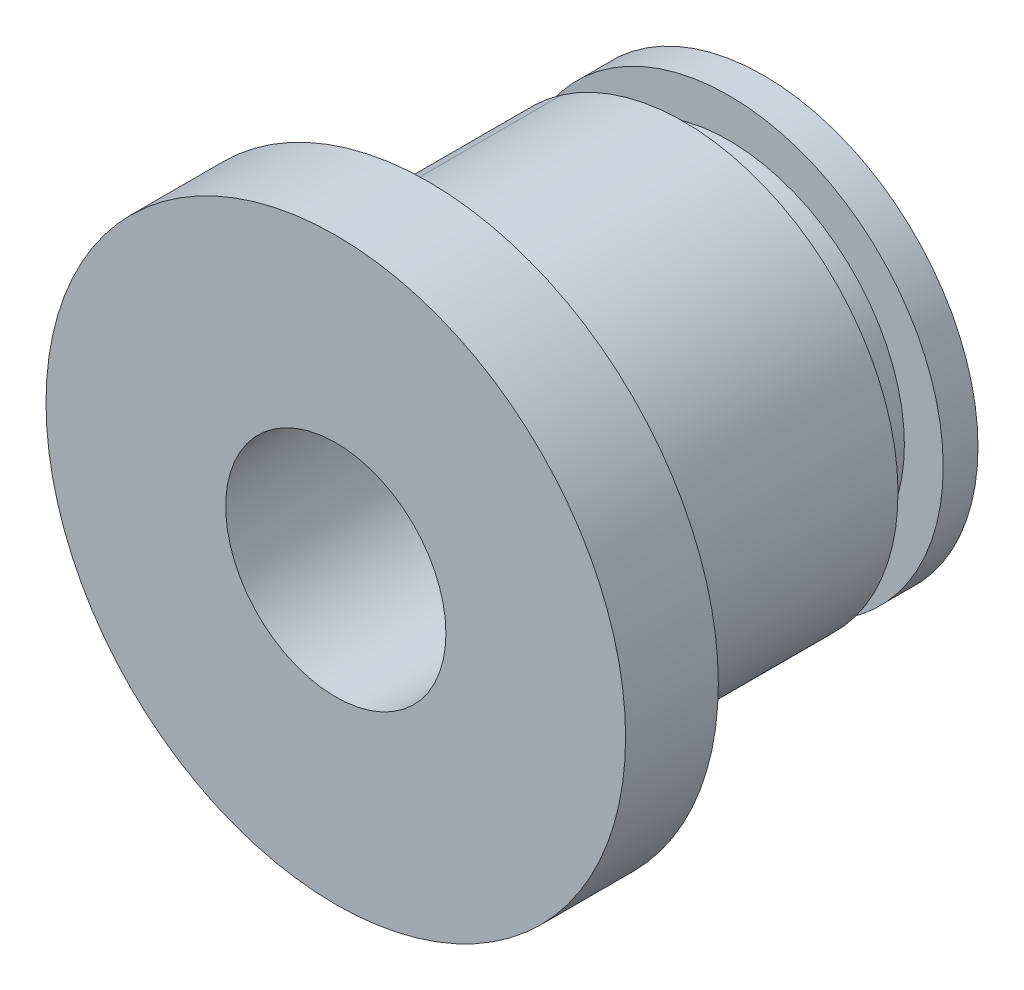
ISO-10303-21;
HEADER;
FILE_DESCRIPTION(('STEP AP214'),'2;1');
FILE_NAME('part.step','',(''),(''),'','','');
FILE_SCHEMA(('AUTOMOTIVE_DESIGN { 1 0 10303 214 1 1 1 1 }'));
ENDSEC;
DATA;
#1=APPLICATION_CONTEXT('core data for automotive mechanical design processes');
#2=APPLICATION_PROTOCOL_DEFINITION('international standard','automotive_design',2000,#1);
#3=PRODUCT_CONTEXT('',#1,'mechanical');
#4=PRODUCT('Part','Part','',(#3));
#5=PRODUCT_RELATED_PRODUCT_CATEGORY('part','',(#4));
#6=PRODUCT_DEFINITION_FORMATION('','',#4);
#7=PRODUCT_DEFINITION_CONTEXT('part definition',#1,'design');
#8=PRODUCT_DEFINITION('design','',#6,#7);
#9=PRODUCT_DEFINITION_SHAPE('','',#8);
#10=(LENGTH_UNIT() NAMED_UNIT(*) SI_UNIT(.MILLI.,.METRE.));
#11=(NAMED_UNIT(*) PLANE_ANGLE_UNIT() SI_UNIT($,.RADIAN.));
#12=(NAMED_UNIT(*) SI_UNIT($,.STERADIAN.) SOLID_ANGLE_UNIT());
#13=UNCERTAINTY_MEASURE_WITH_UNIT(LENGTH_MEASURE(1.E-05),#10,'distance_accuracy_value','');
#14=(GEOMETRIC_REPRESENTATION_CONTEXT(3) GLOBAL_UNCERTAINTY_ASSIGNED_CONTEXT((#13)) GLOBAL_UNIT_ASSIGNED_CONTEXT((#10,
#11,#12)) REPRESENTATION_CONTEXT('',''));
#15=CARTESIAN_POINT('',(0.,0.,0.));
#16=DIRECTION('',(0.,0.,1.));
#17=DIRECTION('',(1.,0.,0.));
#18=AXIS2_PLACEMENT_3D('',#15,#16,#17);
#19=CARTESIAN_POINT('',(0.,0.,-7.3406));
#20=DIRECTION('',(0.,0.,1.));
#21=DIRECTION('',(1.,0.,0.));
#22=AXIS2_PLACEMENT_3D('',#19,#20,#21);
#23=CYLINDRICAL_SURFACE('',#22,4.699);
#24=DIRECTION('',(0.,0.,1.));
#25=VECTOR('',#24,1.);
#26=CARTESIAN_POINT('',(2.64182857750206,-3.88604461722886,-7.3406));
#27=LINE('',#26,#25);
#28=CARTESIAN_POINT('',(2.64182857750206,-3.88604461722886,-5.588));
#29=VERTEX_POINT('',#28);
#30=CARTESIAN_POINT('',(2.64182857750206,-3.88604461722886,0.));
#31=VERTEX_POINT('',#30);
#32=EDGE_CURVE('E11',#29,#31,#27,.T.);
#33=ORIENTED_EDGE('',*,*,#32,.F.);
#34=CARTESIAN_POINT('',(0.,0.,-5.588));
#35=DIRECTION('',(0.,0.,1.));
#36=DIRECTION('',(1.,0.,0.));
#37=AXIS2_PLACEMENT_3D('',#34,#35,#36);
#38=CIRCLE('',#37,4.699);
#39=CARTESIAN_POINT('',(-2.6677771593214,3.86827688101602,-5.588));
#40=VERTEX_POINT('',#39);
#41=EDGE_CURVE('E77',#29,#40,#38,.T.);
#42=ORIENTED_EDGE('',*,*,#41,.T.);
#43=DIRECTION('',(0.,0.,1.));
#44=VECTOR('',#43,1.);
#45=CARTESIAN_POINT('',(-2.6677771593214,3.86827688101602,-7.3406));
#46=LINE('',#45,#44);
#47=CARTESIAN_POINT('',(-2.6677771593214,3.86827688101602,0.));
#48=VERTEX_POINT('',#47);
#49=EDGE_CURVE('E59',#48,#40,#46,.F.);
#50=ORIENTED_EDGE('',*,*,#49,.F.);
#51=CARTESIAN_POINT('',(0.,0.,0.));
#52=DIRECTION('',(0.,0.,-1.));
#53=DIRECTION('',(-1.,0.,0.));
#54=AXIS2_PLACEMENT_3D('',#51,#52,#53);
#55=CIRCLE('',#54,4.699);
#56=EDGE_CURVE('E76',#48,#31,#55,.T.);
#57=ORIENTED_EDGE('',*,*,#56,.T.);
#58=EDGE_LOOP('',(#33,#42,#50,#57));
#59=FACE_BOUND('',#58,.T.);
#60=ADVANCED_FACE('F49',(#59),#23,.T.);
#61=EDGE_CURVE('E121',#40,#29,#38,.T.);
#62=ORIENTED_EDGE('',*,*,#61,.T.);
#63=ORIENTED_EDGE('',*,*,#32,.T.);
#64=EDGE_CURVE('E82',#31,#48,#55,.T.);
#65=ORIENTED_EDGE('',*,*,#64,.T.);
#66=ORIENTED_EDGE('',*,*,#49,.T.);
#67=EDGE_LOOP('',(#62,#63,#65,#66));
#68=FACE_BOUND('',#67,.T.);
#69=ADVANCED_FACE('F83',(#68),#23,.T.);
#70=CARTESIAN_POINT('',(0.,0.,2.032));
#71=DIRECTION('',(0.,0.,-1.));
#72=DIRECTION('',(-1.,0.,0.));
#73=AXIS2_PLACEMENT_3D('',#70,#71,#72);
#74=CYLINDRICAL_SURFACE('',#73,6.35);
#75=CARTESIAN_POINT('',(0.,0.,2.032));
#76=DIRECTION('',(0.,0.,1.));
#77=DIRECTION('',(1.,0.,0.));
#78=AXIS2_PLACEMENT_3D('',#75,#76,#77);
#79=CIRCLE('',#78,6.35);
#80=CARTESIAN_POINT('',(6.35,0.,2.032));
#81=VERTEX_POINT('',#80);
#82=EDGE_CURVE('E86',#81,#81,#79,.T.);
#83=ORIENTED_EDGE('',*,*,#82,.F.);
#84=EDGE_LOOP('',(#83));
#85=FACE_BOUND('',#84,.T.);
#86=CARTESIAN_POINT('',(0.,0.,0.));
#87=DIRECTION('',(0.,0.,1.));
#88=DIRECTION('',(1.,0.,0.));
#89=AXIS2_PLACEMENT_3D('',#86,#87,#88);
#90=CIRCLE('',#89,6.35);
#91=CARTESIAN_POINT('',(6.35,0.,0.));
#92=VERTEX_POINT('',#91);
#93=EDGE_CURVE('E98',#92,#92,#90,.T.);
#94=ORIENTED_EDGE('',*,*,#93,.T.);
#95=EDGE_LOOP('',(#94));
#96=FACE_BOUND('',#95,.T.);
#97=ADVANCED_FACE('F51',(#85,#96),#74,.T.);
#98=CARTESIAN_POINT('',(0.,0.,2.032));
#99=DIRECTION('',(0.,0.,1.));
#100=DIRECTION('',(1.,0.,0.));
#101=AXIS2_PLACEMENT_3D('',#98,#99,#100);
#102=PLANE('',#101);
#103=CARTESIAN_POINT('',(0.,0.,2.032));
#104=DIRECTION('',(0.,0.,1.));
#105=DIRECTION('',(1.,0.,0.));
#106=AXIS2_PLACEMENT_3D('',#103,#104,#105);
#107=CIRCLE('',#106,2.413);
#108=CARTESIAN_POINT('',(2.413,0.,2.032));
#109=VERTEX_POINT('',#108);
#110=EDGE_CURVE('E124',#109,#109,#107,.T.);
#111=ORIENTED_EDGE('',*,*,#110,.F.);
#112=EDGE_LOOP('',(#111));
#113=FACE_BOUND('',#112,.T.);
#114=ORIENTED_EDGE('',*,*,#82,.T.);
#115=EDGE_LOOP('',(#114));
#116=FACE_BOUND('',#115,.T.);
#117=ADVANCED_FACE('F158',(#113,#116),#102,.T.);
#118=CARTESIAN_POINT('',(0.,0.,0.));
#119=DIRECTION('',(0.,0.,1.));
#120=DIRECTION('',(1.,0.,0.));
#121=AXIS2_PLACEMENT_3D('',#118,#119,#120);
#122=PLANE('',#121);
#123=ORIENTED_EDGE('',*,*,#56,.F.);
#124=ORIENTED_EDGE('',*,*,#64,.F.);
#125=EDGE_LOOP('',(#123,#124));
#126=FACE_BOUND('',#125,.T.);
#127=ORIENTED_EDGE('',*,*,#93,.F.);
#128=EDGE_LOOP('',(#127));
#129=FACE_BOUND('',#128,.T.);
#130=ADVANCED_FACE('F88',(#126,#129),#122,.F.);
#131=CARTESIAN_POINT('',(0.,0.,-5.588));
#132=DIRECTION('',(0.,0.,-1.));
#133=DIRECTION('',(-1.,0.,0.));
#134=AXIS2_PLACEMENT_3D('',#131,#132,#133);
#135=PLANE('',#134);
#136=CARTESIAN_POINT('',(0.,0.,-5.588));
#137=DIRECTION('',(0.,0.,1.));
#138=DIRECTION('',(1.,0.,0.));
#139=AXIS2_PLACEMENT_3D('',#136,#137,#138);
#140=CIRCLE('',#139,3.8481);
#141=CARTESIAN_POINT('',(3.8481,0.,-5.588));
#142=VERTEX_POINT('',#141);
#143=EDGE_CURVE('E105',#142,#142,#140,.T.);
#144=ORIENTED_EDGE('',*,*,#143,.T.);
#145=EDGE_LOOP('',(#144));
#146=FACE_BOUND('',#145,.T.);
#147=ORIENTED_EDGE('',*,*,#61,.F.);
#148=ORIENTED_EDGE('',*,*,#41,.F.);
#149=EDGE_LOOP('',(#147,#148));
#150=FACE_BOUND('',#149,.T.);
#151=ADVANCED_FACE('F161',(#146,#150),#135,.T.);
#152=CARTESIAN_POINT('',(0.,0.,6.54906266343876));
#153=DIRECTION('',(0.,0.,1.));
#154=DIRECTION('',(1.,0.,0.));
#155=AXIS2_PLACEMENT_3D('',#152,#153,#154);
#156=CYLINDRICAL_SURFACE('',#155,3.8481);
#157=CARTESIAN_POINT('',(0.,0.,-6.5786));
#158=DIRECTION('',(0.,0.,1.));
#159=DIRECTION('',(1.,0.,0.));
#160=AXIS2_PLACEMENT_3D('',#157,#158,#159);
#161=CIRCLE('',#160,3.8481);
#162=CARTESIAN_POINT('',(3.8481,0.,-6.5786));
#163=VERTEX_POINT('',#162);
#164=EDGE_CURVE('E110',#163,#163,#161,.T.);
#165=ORIENTED_EDGE('',*,*,#164,.T.);
#166=EDGE_LOOP('',(#165));
#167=FACE_BOUND('',#166,.T.);
#168=ORIENTED_EDGE('',*,*,#143,.F.);
#169=EDGE_LOOP('',(#168));
#170=FACE_BOUND('',#169,.T.);
#171=ADVANCED_FACE('F149',(#167,#170),#156,.T.);
#172=CARTESIAN_POINT('',(0.,0.,-6.5786));
#173=DIRECTION('',(0.,0.,-1.));
#174=DIRECTION('',(-1.,0.,0.));
#175=AXIS2_PLACEMENT_3D('',#172,#173,#174);
#176=PLANE('',#175);
#177=ORIENTED_EDGE('',*,*,#164,.F.);
#178=EDGE_LOOP('',(#177));
#179=FACE_BOUND('',#178,.T.);
#180=CARTESIAN_POINT('',(0.,0.,-6.5786));
#181=DIRECTION('',(0.,0.,1.));
#182=DIRECTION('',(1.,0.,0.));
#183=AXIS2_PLACEMENT_3D('',#180,#181,#182);
#184=CIRCLE('',#183,4.699);
#185=CARTESIAN_POINT('',(4.699,0.,-6.5786));
#186=VERTEX_POINT('',#185);
#187=EDGE_CURVE('E115',#186,#186,#184,.T.);
#188=ORIENTED_EDGE('',*,*,#187,.T.);
#189=EDGE_LOOP('',(#188));
#190=FACE_BOUND('',#189,.T.);
#191=ADVANCED_FACE('F139',(#179,#190),#176,.F.);
#192=CARTESIAN_POINT('',(0.,0.,-7.3406));
#193=DIRECTION('',(0.,0.,-1.));
#194=DIRECTION('',(-1.,0.,0.));
#195=AXIS2_PLACEMENT_3D('',#192,#193,#194);
#196=PLANE('',#195);
#197=CARTESIAN_POINT('',(0.,0.,-7.3406));
#198=DIRECTION('',(0.,0.,-1.));
#199=DIRECTION('',(-1.,0.,0.));
#200=AXIS2_PLACEMENT_3D('',#197,#198,#199);
#201=CIRCLE('',#200,2.413);
#202=CARTESIAN_POINT('',(2.413,0.,-7.3406));
#203=VERTEX_POINT('',#202);
#204=EDGE_CURVE('E53',#203,#203,#201,.T.);
#205=ORIENTED_EDGE('',*,*,#204,.F.);
#206=EDGE_LOOP('',(#205));
#207=FACE_BOUND('',#206,.T.);
#208=CARTESIAN_POINT('',(0.,0.,-7.3406));
#209=DIRECTION('',(0.,0.,-1.));
#210=DIRECTION('',(-1.,0.,0.));
#211=AXIS2_PLACEMENT_3D('',#208,#209,#210);
#212=CIRCLE('',#211,4.699);
#213=CARTESIAN_POINT('',(-4.699,0.,-7.3406));
#214=VERTEX_POINT('',#213);
#215=EDGE_CURVE('E93',#214,#214,#212,.T.);
#216=ORIENTED_EDGE('',*,*,#215,.T.);
#217=EDGE_LOOP('',(#216));
#218=FACE_BOUND('',#217,.T.);
#219=ADVANCED_FACE('F136',(#207,#218),#196,.T.);
#220=ORIENTED_EDGE('',*,*,#187,.F.);
#221=EDGE_LOOP('',(#220));
#222=FACE_BOUND('',#221,.T.);
#223=ORIENTED_EDGE('',*,*,#215,.F.);
#224=EDGE_LOOP('',(#223));
#225=FACE_BOUND('',#224,.T.);
#226=ADVANCED_FACE('F138',(#222,#225),#23,.T.);
#227=CARTESIAN_POINT('',(0.,0.,-13.208));
#228=DIRECTION('',(0.,0.,1.));
#229=DIRECTION('',(1.,0.,0.));
#230=AXIS2_PLACEMENT_3D('',#227,#228,#229);
#231=CYLINDRICAL_SURFACE('',#230,2.413);
#232=CARTESIAN_POINT('',(2.413,0.,-7.3406));
#233=CARTESIAN_POINT('',(2.413,0.,-7.24296875));
#234=CARTESIAN_POINT('',(2.413,0.,-7.1453375));
#235=CARTESIAN_POINT('',(2.413,0.,-6.950075));
#236=CARTESIAN_POINT('',(2.413,0.,-6.85244375));
#237=CARTESIAN_POINT('',(2.413,0.,-6.65718125));
#238=CARTESIAN_POINT('',(2.413,0.,-6.55955));
#239=CARTESIAN_POINT('',(2.413,0.,-6.3642875));
#240=CARTESIAN_POINT('',(2.413,0.,-6.26665625));
#241=CARTESIAN_POINT('',(2.413,0.,-6.07139375));
#242=CARTESIAN_POINT('',(2.413,0.,-5.9737625));
#243=CARTESIAN_POINT('',(2.413,0.,-5.7785));
#244=CARTESIAN_POINT('',(2.413,0.,-5.68086875));
#245=CARTESIAN_POINT('',(2.413,0.,-5.48560625));
#246=CARTESIAN_POINT('',(2.413,0.,-5.387975));
#247=CARTESIAN_POINT('',(2.413,0.,-5.1927125));
#248=CARTESIAN_POINT('',(2.413,0.,-5.09508125));
#249=CARTESIAN_POINT('',(2.413,0.,-4.89981875));
#250=CARTESIAN_POINT('',(2.413,0.,-4.8021875));
#251=CARTESIAN_POINT('',(2.413,0.,-4.606925));
#252=CARTESIAN_POINT('',(2.413,0.,-4.50929375));
#253=CARTESIAN_POINT('',(2.413,0.,-4.31403125));
#254=CARTESIAN_POINT('',(2.413,0.,-4.2164));
#255=CARTESIAN_POINT('',(2.413,0.,-4.0211375));
#256=CARTESIAN_POINT('',(2.413,0.,-3.92350625));
#257=CARTESIAN_POINT('',(2.413,0.,-3.72824375));
#258=CARTESIAN_POINT('',(2.413,0.,-3.6306125));
#259=CARTESIAN_POINT('',(2.413,0.,-3.43535));
#260=CARTESIAN_POINT('',(2.413,0.,-3.33771875));
#261=CARTESIAN_POINT('',(2.413,0.,-3.14245625));
#262=CARTESIAN_POINT('',(2.413,0.,-3.044825));
#263=CARTESIAN_POINT('',(2.413,0.,-2.8495625));
#264=CARTESIAN_POINT('',(2.413,0.,-2.75193125));
#265=CARTESIAN_POINT('',(2.413,0.,-2.55666875));
#266=CARTESIAN_POINT('',(2.413,0.,-2.4590375));
#267=CARTESIAN_POINT('',(2.413,0.,-2.263775));
#268=CARTESIAN_POINT('',(2.413,0.,-2.16614375));
#269=CARTESIAN_POINT('',(2.413,0.,-1.97088125));
#270=CARTESIAN_POINT('',(2.413,0.,-1.87325));
#271=CARTESIAN_POINT('',(2.413,0.,-1.6779875));
#272=CARTESIAN_POINT('',(2.413,0.,-1.58035625));
#273=CARTESIAN_POINT('',(2.413,0.,-1.38509375));
#274=CARTESIAN_POINT('',(2.413,0.,-1.2874625));
#275=CARTESIAN_POINT('',(2.413,0.,-1.0922));
#276=CARTESIAN_POINT('',(2.413,0.,-0.994568749999999));
#277=CARTESIAN_POINT('',(2.413,0.,-0.799306249999999));
#278=CARTESIAN_POINT('',(2.413,0.,-0.701674999999999));
#279=CARTESIAN_POINT('',(2.413,0.,-0.5064125));
#280=CARTESIAN_POINT('',(2.413,0.,-0.40878125));
#281=CARTESIAN_POINT('',(2.413,0.,-0.21351875));
#282=CARTESIAN_POINT('',(2.413,0.,-0.115887499999999));
#283=CARTESIAN_POINT('',(2.413,0.,0.0793750000000007));
#284=CARTESIAN_POINT('',(2.413,0.,0.177006250000001));
#285=CARTESIAN_POINT('',(2.413,0.,0.372268750000001));
#286=CARTESIAN_POINT('',(2.413,0.,0.469900000000001));
#287=CARTESIAN_POINT('',(2.413,0.,0.665162500000001));
#288=CARTESIAN_POINT('',(2.413,0.,0.762793750000001));
#289=CARTESIAN_POINT('',(2.413,0.,0.958056250000001));
#290=CARTESIAN_POINT('',(2.413,0.,1.0556875));
#291=CARTESIAN_POINT('',(2.413,0.,1.25095));
#292=CARTESIAN_POINT('',(2.413,0.,1.34858125));
#293=CARTESIAN_POINT('',(2.413,0.,1.54384375));
#294=CARTESIAN_POINT('',(2.413,0.,1.641475));
#295=CARTESIAN_POINT('',(2.413,0.,1.8367375));
#296=CARTESIAN_POINT('',(2.413,0.,1.93436875));
#297=CARTESIAN_POINT('',(2.413,0.,2.032));
#298=B_SPLINE_CURVE_WITH_KNOTS('',3,(#232,#233,#234,#235,#236,#237,#238,#239,#240,#241,#242,
#243,#244,#245,#246,#247,#248,#249,#250,#251,#252,#253,#254,#255,#256,#257,#258,#259,#260,#261,
#262,#263,#264,#265,#266,#267,#268,#269,#270,#271,#272,#273,#274,#275,#276,#277,#278,#279,#280,
#281,#282,#283,#284,#285,#286,#287,#288,#289,#290,#291,#292,#293,#294,#295,#296,#297),
.UNSPECIFIED.,.F.,.F.,(4,2,2,2,2,2,2,2,2,2,2,2,2,2,2,2,2,2,2,2,2,2,2,2,2,2,2,2,2,2,2,2,4),(0.,
0.29289375,0.5857875,0.87868125,1.171575,1.46446875,1.7573625,2.05025625,2.34315,2.63604375,
2.9289375,3.22183125,3.514725,3.80761875,4.1005125,4.39340625,4.6863,4.97919375,5.2720875,
5.56498125,5.857875,6.15076875,6.4436625,6.73655625,7.02945,7.32234375,7.6152375,7.90813125,
8.201025,8.49391875,8.7868125,9.07970625,9.3726),.UNSPECIFIED.);
#299=EDGE_CURVE('BSEAM134',#203,#109,#298,.T.);
#300=ORIENTED_EDGE('',*,*,#204,.T.);
#301=ORIENTED_EDGE('',*,*,#110,.T.);
#302=ORIENTED_EDGE('',*,*,#299,.T.);
#303=ORIENTED_EDGE('',*,*,#299,.F.);
#304=EDGE_LOOP('',(#300,#302,#301,#303));
#305=FACE_BOUND('',#304,.T.);
#306=ADVANCED_FACE('F134',(#305),#231,.F.);
#307=CLOSED_SHELL('',(#60,#69,#97,#117,#130,#151,#171,#191,#219,#226,#306));
#308=MANIFOLD_SOLID_BREP('B2',#307);
#309=ADVANCED_BREP_SHAPE_REPRESENTATION('',(#18,#308),#14);
#310=SHAPE_DEFINITION_REPRESENTATION(#9,#309);
ENDSEC;
END-ISO-10303-21;
